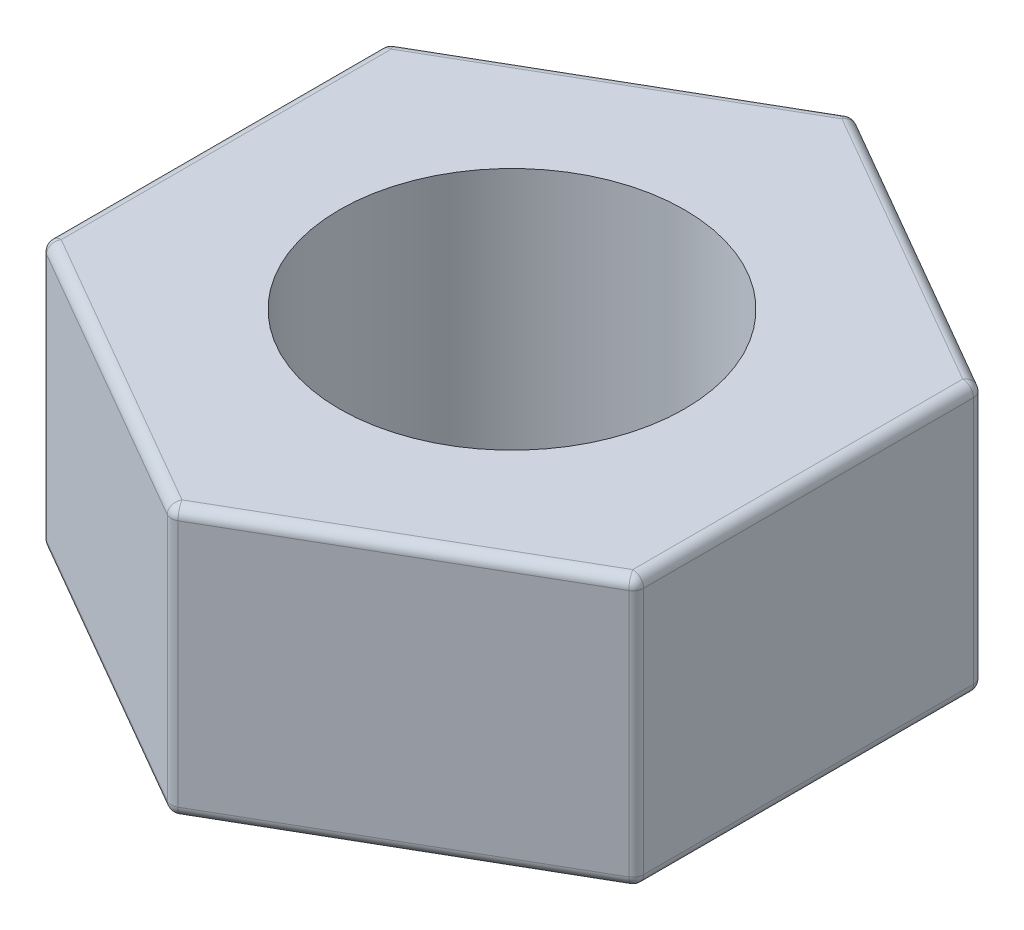
ISO-10303-21;
HEADER;
FILE_DESCRIPTION(('STEP AP214'),'2;1');
FILE_NAME('part.step','',(''),(''),'','','');
FILE_SCHEMA(('AUTOMOTIVE_DESIGN { 1 0 10303 214 1 1 1 1 }'));
ENDSEC;
DATA;
#1=APPLICATION_CONTEXT('core data for automotive mechanical design processes');
#2=APPLICATION_PROTOCOL_DEFINITION('international standard','automotive_design',2000,#1);
#3=PRODUCT_CONTEXT('',#1,'mechanical');
#4=PRODUCT('Part','Part','',(#3));
#5=PRODUCT_RELATED_PRODUCT_CATEGORY('part','',(#4));
#6=PRODUCT_DEFINITION_FORMATION('','',#4);
#7=PRODUCT_DEFINITION_CONTEXT('part definition',#1,'design');
#8=PRODUCT_DEFINITION('design','',#6,#7);
#9=PRODUCT_DEFINITION_SHAPE('','',#8);
#10=(LENGTH_UNIT() NAMED_UNIT(*) SI_UNIT(.MILLI.,.METRE.));
#11=(NAMED_UNIT(*) PLANE_ANGLE_UNIT() SI_UNIT($,.RADIAN.));
#12=(NAMED_UNIT(*) SI_UNIT($,.STERADIAN.) SOLID_ANGLE_UNIT());
#13=UNCERTAINTY_MEASURE_WITH_UNIT(LENGTH_MEASURE(1.E-05),#10,'distance_accuracy_value','');
#14=(GEOMETRIC_REPRESENTATION_CONTEXT(3) GLOBAL_UNCERTAINTY_ASSIGNED_CONTEXT((#13)) GLOBAL_UNIT_ASSIGNED_CONTEXT((#10,
#11,#12)) REPRESENTATION_CONTEXT('',''));
#15=CARTESIAN_POINT('',(0.,0.,0.));
#16=DIRECTION('',(0.,0.,1.));
#17=DIRECTION('',(1.,0.,0.));
#18=AXIS2_PLACEMENT_3D('',#15,#16,#17);
#19=CARTESIAN_POINT('',(0.,2.5,0.));
#20=DIRECTION('',(0.,1.,0.));
#21=DIRECTION('',(0.,0.,1.));
#22=AXIS2_PLACEMENT_3D('',#19,#20,#21);
#23=PLANE('',#22);
#24=DIRECTION('',(0.,0.,-1.));
#25=VECTOR('',#24,1.);
#26=CARTESIAN_POINT('',(2.64999999999998,2.5,-1.5877132402715));
#27=LINE('',#26,#25);
#28=CARTESIAN_POINT('',(2.65000000000002,2.5,1.52997821335248));
#29=VERTEX_POINT('',#28);
#30=CARTESIAN_POINT('',(2.64999999999998,2.5,-1.52997821335254));
#31=VERTEX_POINT('',#30);
#32=EDGE_CURVE('E167',#29,#31,#27,.T.);
#33=ORIENTED_EDGE('',*,*,#32,.T.);
#34=DIRECTION('',(-0.866025403784442,0.,-0.499999999999995));
#35=VECTOR('',#34,1.);
#36=CARTESIAN_POINT('',(-0.0499999999999995,2.5,-3.0888239401645));
#37=LINE('',#36,#35);
#38=CARTESIAN_POINT('',(0.,2.5,-3.05995642670502));
#39=VERTEX_POINT('',#38);
#40=EDGE_CURVE('E203',#31,#39,#37,.T.);
#41=ORIENTED_EDGE('',*,*,#40,.T.);
#42=DIRECTION('',(-0.866025403784438,0.,0.500000000000001));
#43=VECTOR('',#42,1.);
#44=CARTESIAN_POINT('',(-2.70000000000001,2.5,-1.50111069989302));
#45=LINE('',#44,#43);
#46=CARTESIAN_POINT('',(-2.65000000000001,2.5,-1.5299782133525));
#47=VERTEX_POINT('',#46);
#48=EDGE_CURVE('E201',#39,#47,#45,.T.);
#49=ORIENTED_EDGE('',*,*,#48,.T.);
#50=DIRECTION('',(0.,0.,1.));
#51=VECTOR('',#50,1.);
#52=CARTESIAN_POINT('',(-2.64999999999999,2.5,1.58771324027148));
#53=LINE('',#52,#51);
#54=CARTESIAN_POINT('',(-2.64999999999999,2.5,1.52997821335252));
#55=VERTEX_POINT('',#54);
#56=EDGE_CURVE('E163',#47,#55,#53,.T.);
#57=ORIENTED_EDGE('',*,*,#56,.T.);
#58=DIRECTION('',(0.866025403784442,0.,0.499999999999995));
#59=VECTOR('',#58,1.);
#60=CARTESIAN_POINT('',(0.050000000000022,2.5,3.0888239401645));
#61=LINE('',#60,#59);
#62=CARTESIAN_POINT('',(0.,2.5,3.05995642670502));
#63=VERTEX_POINT('',#62);
#64=EDGE_CURVE('E156',#55,#63,#61,.T.);
#65=ORIENTED_EDGE('',*,*,#64,.T.);
#66=DIRECTION('',(0.866025403784435,0.,-0.500000000000007));
#67=VECTOR('',#66,1.);
#68=CARTESIAN_POINT('',(2.70000000000002,2.5,1.501110699893));
#69=LINE('',#68,#67);
#70=EDGE_CURVE('E160',#63,#29,#69,.T.);
#71=ORIENTED_EDGE('',*,*,#70,.T.);
#72=EDGE_LOOP('',(#33,#41,#49,#57,#65,#71));
#73=FACE_BOUND('',#72,.T.);
#74=CARTESIAN_POINT('',(0.,2.5,0.));
#75=DIRECTION('',(0.,1.,0.));
#76=DIRECTION('',(0.,0.,1.));
#77=AXIS2_PLACEMENT_3D('',#74,#75,#76);
#78=CIRCLE('',#77,1.6);
#79=CARTESIAN_POINT('',(0.,2.5,1.6));
#80=VERTEX_POINT('',#79);
#81=EDGE_CURVE('E192',#80,#80,#78,.T.);
#82=ORIENTED_EDGE('',*,*,#81,.F.);
#83=EDGE_LOOP('',(#82));
#84=FACE_BOUND('',#83,.T.);
#85=ADVANCED_FACE('F33',(#73,#84),#23,.T.);
#86=CARTESIAN_POINT('',(0.,0.,0.));
#87=DIRECTION('',(0.,1.,0.));
#88=DIRECTION('',(0.,0.,1.));
#89=AXIS2_PLACEMENT_3D('',#86,#87,#88);
#90=PLANE('',#89);
#91=DIRECTION('',(-0.866025403784438,0.,0.500000000000001));
#92=VECTOR('',#91,1.);
#93=CARTESIAN_POINT('',(-1.325,0.,-2.29496732002876));
#94=LINE('',#93,#92);
#95=CARTESIAN_POINT('',(-2.65000000000001,0.,-1.5299782133525));
#96=VERTEX_POINT('',#95);
#97=CARTESIAN_POINT('',(0.,0.,-3.05995642670502));
#98=VERTEX_POINT('',#97);
#99=EDGE_CURVE('E223',#96,#98,#94,.F.);
#100=ORIENTED_EDGE('',*,*,#99,.T.);
#101=DIRECTION('',(-0.866025403784442,0.,-0.499999999999995));
#102=VECTOR('',#101,1.);
#103=CARTESIAN_POINT('',(1.32499999999999,0.,-2.29496732002878));
#104=LINE('',#103,#102);
#105=CARTESIAN_POINT('',(2.64999999999998,0.,-1.52997821335254));
#106=VERTEX_POINT('',#105);
#107=EDGE_CURVE('E225',#98,#106,#104,.F.);
#108=ORIENTED_EDGE('',*,*,#107,.T.);
#109=DIRECTION('',(0.,0.,-1.));
#110=VECTOR('',#109,1.);
#111=CARTESIAN_POINT('',(2.65,0.,0.));
#112=LINE('',#111,#110);
#113=CARTESIAN_POINT('',(2.65000000000002,0.,1.52997821335248));
#114=VERTEX_POINT('',#113);
#115=EDGE_CURVE('E217',#106,#114,#112,.F.);
#116=ORIENTED_EDGE('',*,*,#115,.T.);
#117=DIRECTION('',(0.866025403784435,0.,-0.500000000000007));
#118=VECTOR('',#117,1.);
#119=CARTESIAN_POINT('',(1.32500000000002,0.,2.29496732002875));
#120=LINE('',#119,#118);
#121=CARTESIAN_POINT('',(0.,0.,3.05995642670502));
#122=VERTEX_POINT('',#121);
#123=EDGE_CURVE('E215',#114,#122,#120,.F.);
#124=ORIENTED_EDGE('',*,*,#123,.T.);
#125=DIRECTION('',(0.866025403784442,0.,0.499999999999995));
#126=VECTOR('',#125,1.);
#127=CARTESIAN_POINT('',(-1.32499999999999,0.,2.29496732002877));
#128=LINE('',#127,#126);
#129=CARTESIAN_POINT('',(-2.64999999999999,0.,1.52997821335252));
#130=VERTEX_POINT('',#129);
#131=EDGE_CURVE('E219',#122,#130,#128,.F.);
#132=ORIENTED_EDGE('',*,*,#131,.T.);
#133=DIRECTION('',(0.,0.,1.));
#134=VECTOR('',#133,1.);
#135=CARTESIAN_POINT('',(-2.65,0.,0.));
#136=LINE('',#135,#134);
#137=EDGE_CURVE('E221',#130,#96,#136,.F.);
#138=ORIENTED_EDGE('',*,*,#137,.T.);
#139=EDGE_LOOP('',(#100,#108,#116,#124,#132,#138));
#140=FACE_BOUND('',#139,.T.);
#141=CARTESIAN_POINT('',(0.,0.,0.));
#142=DIRECTION('',(0.,1.,0.));
#143=DIRECTION('',(0.,0.,1.));
#144=AXIS2_PLACEMENT_3D('',#141,#142,#143);
#145=CIRCLE('',#144,1.6);
#146=CARTESIAN_POINT('',(0.,0.,1.6));
#147=VERTEX_POINT('',#146);
#148=EDGE_CURVE('E196',#147,#147,#145,.T.);
#149=ORIENTED_EDGE('',*,*,#148,.T.);
#150=EDGE_LOOP('',(#149));
#151=FACE_BOUND('',#150,.T.);
#152=ADVANCED_FACE('F362',(#140,#151),#90,.F.);
#153=CARTESIAN_POINT('',(2.74999999999998,2.5,-1.5877132402715));
#154=DIRECTION('',(-0.499999999999995,0.,0.866025403784442));
#155=DIRECTION('',(0.866025403784442,0.,0.499999999999995));
#156=AXIS2_PLACEMENT_3D('',#153,#154,#155);
#157=PLANE('',#156);
#158=DIRECTION('',(-0.866025403784442,0.,-0.499999999999995));
#159=VECTOR('',#158,1.);
#160=CARTESIAN_POINT('',(2.74999999999998,0.0999999999999998,-1.5877132402715));
#161=LINE('',#160,#159);
#162=CARTESIAN_POINT('',(2.69999999999998,0.0999999999999998,-1.61658075373098));
#163=VERTEX_POINT('',#162);
#164=CARTESIAN_POINT('',(0.0499999999999996,0.0999999999999998,-3.14655896708346));
#165=VERTEX_POINT('',#164);
#166=EDGE_CURVE('E208',#163,#165,#161,.T.);
#167=ORIENTED_EDGE('',*,*,#166,.T.);
#168=DIRECTION('',(0.,-1.,0.));
#169=VECTOR('',#168,1.);
#170=CARTESIAN_POINT('',(0.0499999999999997,2.5,-3.14655896708346));
#171=LINE('',#170,#169);
#172=CARTESIAN_POINT('',(0.0499999999999996,2.4,-3.14655896708346));
#173=VERTEX_POINT('',#172);
#174=EDGE_CURVE('E213',#165,#173,#171,.F.);
#175=ORIENTED_EDGE('',*,*,#174,.T.);
#176=DIRECTION('',(-0.866025403784442,0.,-0.499999999999995));
#177=VECTOR('',#176,1.);
#178=CARTESIAN_POINT('',(2.74999999999998,2.4,-1.5877132402715));
#179=LINE('',#178,#177);
#180=CARTESIAN_POINT('',(2.69999999999998,2.4,-1.61658075373098));
#181=VERTEX_POINT('',#180);
#182=EDGE_CURVE('E210',#173,#181,#179,.F.);
#183=ORIENTED_EDGE('',*,*,#182,.T.);
#184=DIRECTION('',(0.,-1.,0.));
#185=VECTOR('',#184,1.);
#186=CARTESIAN_POINT('',(2.69999999999998,2.5,-1.61658075373098));
#187=LINE('',#186,#185);
#188=EDGE_CURVE('E206',#181,#163,#187,.T.);
#189=ORIENTED_EDGE('',*,*,#188,.T.);
#190=EDGE_LOOP('',(#167,#175,#183,#189));
#191=FACE_BOUND('',#190,.T.);
#192=ADVANCED_FACE('F384',(#191),#157,.F.);
#193=CARTESIAN_POINT('',(0.,2.5,-3.17542648054294));
#194=DIRECTION('',(0.500000000000001,0.,0.866025403784438));
#195=DIRECTION('',(0.866025403784438,0.,-0.500000000000001));
#196=AXIS2_PLACEMENT_3D('',#193,#194,#195);
#197=PLANE('',#196);
#198=DIRECTION('',(-0.866025403784438,0.,0.500000000000001));
#199=VECTOR('',#198,1.);
#200=CARTESIAN_POINT('',(0.,2.4,-3.17542648054294));
#201=LINE('',#200,#199);
#202=CARTESIAN_POINT('',(-2.70000000000001,2.4,-1.61658075373095));
#203=VERTEX_POINT('',#202);
#204=CARTESIAN_POINT('',(-0.0499999999999998,2.4,-3.14655896708346));
#205=VERTEX_POINT('',#204);
#206=EDGE_CURVE('E232',#203,#205,#201,.F.);
#207=ORIENTED_EDGE('',*,*,#206,.T.);
#208=DIRECTION('',(0.,-1.,0.));
#209=VECTOR('',#208,1.);
#210=CARTESIAN_POINT('',(-0.0499999999999998,2.5,-3.14655896708346));
#211=LINE('',#210,#209);
#212=CARTESIAN_POINT('',(-0.0499999999999998,0.0999999999999998,-3.14655896708346));
#213=VERTEX_POINT('',#212);
#214=EDGE_CURVE('E234',#205,#213,#211,.T.);
#215=ORIENTED_EDGE('',*,*,#214,.T.);
#216=DIRECTION('',(-0.866025403784438,0.,0.500000000000001));
#217=VECTOR('',#216,1.);
#218=CARTESIAN_POINT('',(0.,0.0999999999999998,-3.17542648054294));
#219=LINE('',#218,#217);
#220=CARTESIAN_POINT('',(-2.70000000000001,0.0999999999999998,-1.61658075373095));
#221=VERTEX_POINT('',#220);
#222=EDGE_CURVE('E230',#213,#221,#219,.T.);
#223=ORIENTED_EDGE('',*,*,#222,.T.);
#224=DIRECTION('',(0.,-1.,0.));
#225=VECTOR('',#224,1.);
#226=CARTESIAN_POINT('',(-2.70000000000001,2.5,-1.61658075373095));
#227=LINE('',#226,#225);
#228=EDGE_CURVE('E228',#221,#203,#227,.F.);
#229=ORIENTED_EDGE('',*,*,#228,.T.);
#230=EDGE_LOOP('',(#207,#215,#223,#229));
#231=FACE_BOUND('',#230,.T.);
#232=ADVANCED_FACE('F397',(#231),#197,.F.);
#233=CARTESIAN_POINT('',(-2.75,2.5,-1.58771324027147));
#234=DIRECTION('',(1.,0.,0.));
#235=DIRECTION('',(0.,0.,-1.));
#236=AXIS2_PLACEMENT_3D('',#233,#234,#235);
#237=PLANE('',#236);
#238=DIRECTION('',(0.,0.,1.));
#239=VECTOR('',#238,1.);
#240=CARTESIAN_POINT('',(-2.75,2.4,-1.58771324027147));
#241=LINE('',#240,#239);
#242=CARTESIAN_POINT('',(-2.74999999999999,2.4,1.52997821335252));
#243=VERTEX_POINT('',#242);
#244=CARTESIAN_POINT('',(-2.75,2.4,-1.5299782133525));
#245=VERTEX_POINT('',#244);
#246=EDGE_CURVE('E241',#243,#245,#241,.F.);
#247=ORIENTED_EDGE('',*,*,#246,.T.);
#248=DIRECTION('',(0.,-1.,0.));
#249=VECTOR('',#248,1.);
#250=CARTESIAN_POINT('',(-2.75,2.5,-1.5299782133525));
#251=LINE('',#250,#249);
#252=CARTESIAN_POINT('',(-2.75,0.0999999999999998,-1.5299782133525));
#253=VERTEX_POINT('',#252);
#254=EDGE_CURVE('E243',#245,#253,#251,.T.);
#255=ORIENTED_EDGE('',*,*,#254,.T.);
#256=DIRECTION('',(0.,0.,1.));
#257=VECTOR('',#256,1.);
#258=CARTESIAN_POINT('',(-2.75,0.0999999999999998,-1.58771324027147));
#259=LINE('',#258,#257);
#260=CARTESIAN_POINT('',(-2.74999999999999,0.0999999999999998,1.52997821335252));
#261=VERTEX_POINT('',#260);
#262=EDGE_CURVE('E239',#253,#261,#259,.T.);
#263=ORIENTED_EDGE('',*,*,#262,.T.);
#264=DIRECTION('',(0.,-1.,0.));
#265=VECTOR('',#264,1.);
#266=CARTESIAN_POINT('',(-2.74999999999999,2.5,1.52997821335252));
#267=LINE('',#266,#265);
#268=EDGE_CURVE('E237',#261,#243,#267,.F.);
#269=ORIENTED_EDGE('',*,*,#268,.T.);
#270=EDGE_LOOP('',(#247,#255,#263,#269));
#271=FACE_BOUND('',#270,.T.);
#272=ADVANCED_FACE('F393',(#271),#237,.F.);
#273=CARTESIAN_POINT('',(-2.74999999999999,2.5,1.58771324027148));
#274=DIRECTION('',(0.499999999999995,0.,-0.866025403784442));
#275=DIRECTION('',(-0.866025403784442,0.,-0.499999999999995));
#276=AXIS2_PLACEMENT_3D('',#273,#274,#275);
#277=PLANE('',#276);
#278=DIRECTION('',(0.866025403784442,0.,0.499999999999995));
#279=VECTOR('',#278,1.);
#280=CARTESIAN_POINT('',(-2.74999999999999,2.4,1.58771324027148));
#281=LINE('',#280,#279);
#282=CARTESIAN_POINT('',(-0.0499999999999781,2.4,3.14655896708346));
#283=VERTEX_POINT('',#282);
#284=CARTESIAN_POINT('',(-2.69999999999999,2.4,1.61658075373097));
#285=VERTEX_POINT('',#284);
#286=EDGE_CURVE('E174',#283,#285,#281,.F.);
#287=ORIENTED_EDGE('',*,*,#286,.T.);
#288=DIRECTION('',(0.,-1.,0.));
#289=VECTOR('',#288,1.);
#290=CARTESIAN_POINT('',(-2.69999999999999,2.5,1.61658075373097));
#291=LINE('',#290,#289);
#292=CARTESIAN_POINT('',(-2.69999999999999,0.0999999999999998,1.61658075373097));
#293=VERTEX_POINT('',#292);
#294=EDGE_CURVE('E251',#285,#293,#291,.T.);
#295=ORIENTED_EDGE('',*,*,#294,.T.);
#296=DIRECTION('',(0.866025403784442,0.,0.499999999999995));
#297=VECTOR('',#296,1.);
#298=CARTESIAN_POINT('',(-2.74999999999999,0.0999999999999998,1.58771324027148));
#299=LINE('',#298,#297);
#300=CARTESIAN_POINT('',(-0.0499999999999781,0.0999999999999998,3.14655896708346));
#301=VERTEX_POINT('',#300);
#302=EDGE_CURVE('E248',#293,#301,#299,.T.);
#303=ORIENTED_EDGE('',*,*,#302,.T.);
#304=DIRECTION('',(0.,-1.,0.));
#305=VECTOR('',#304,1.);
#306=CARTESIAN_POINT('',(-0.049999999999978,2.5,3.14655896708346));
#307=LINE('',#306,#305);
#308=EDGE_CURVE('E246',#301,#283,#307,.F.);
#309=ORIENTED_EDGE('',*,*,#308,.T.);
#310=EDGE_LOOP('',(#287,#295,#303,#309));
#311=FACE_BOUND('',#310,.T.);
#312=ADVANCED_FACE('F390',(#311),#277,.F.);
#313=CARTESIAN_POINT('',(0.,2.5,3.17542648054294));
#314=DIRECTION('',(-0.500000000000007,0.,-0.866025403784435));
#315=DIRECTION('',(-0.866025403784435,0.,0.500000000000007));
#316=AXIS2_PLACEMENT_3D('',#313,#314,#315);
#317=PLANE('',#316);
#318=DIRECTION('',(0.866025403784435,0.,-0.500000000000007));
#319=VECTOR('',#318,1.);
#320=CARTESIAN_POINT('',(0.,2.4,3.17542648054294));
#321=LINE('',#320,#319);
#322=CARTESIAN_POINT('',(2.70000000000002,2.4,1.61658075373093));
#323=VERTEX_POINT('',#322);
#324=CARTESIAN_POINT('',(0.050000000000022,2.4,3.14655896708346));
#325=VERTEX_POINT('',#324);
#326=EDGE_CURVE('E42',#323,#325,#321,.F.);
#327=ORIENTED_EDGE('',*,*,#326,.T.);
#328=DIRECTION('',(0.,-1.,0.));
#329=VECTOR('',#328,1.);
#330=CARTESIAN_POINT('',(0.050000000000022,2.5,3.14655896708346));
#331=LINE('',#330,#329);
#332=CARTESIAN_POINT('',(0.050000000000022,0.0999999999999998,3.14655896708346));
#333=VERTEX_POINT('',#332);
#334=EDGE_CURVE('E11',#325,#333,#331,.T.);
#335=ORIENTED_EDGE('',*,*,#334,.T.);
#336=DIRECTION('',(0.866025403784435,0.,-0.500000000000007));
#337=VECTOR('',#336,1.);
#338=CARTESIAN_POINT('',(0.,0.0999999999999998,3.17542648054294));
#339=LINE('',#338,#337);
#340=CARTESIAN_POINT('',(2.70000000000002,0.0999999999999998,1.61658075373093));
#341=VERTEX_POINT('',#340);
#342=EDGE_CURVE('E263',#333,#341,#339,.T.);
#343=ORIENTED_EDGE('',*,*,#342,.T.);
#344=DIRECTION('',(0.,-1.,0.));
#345=VECTOR('',#344,1.);
#346=CARTESIAN_POINT('',(2.70000000000002,2.5,1.61658075373093));
#347=LINE('',#346,#345);
#348=EDGE_CURVE('E53',#341,#323,#347,.F.);
#349=ORIENTED_EDGE('',*,*,#348,.T.);
#350=EDGE_LOOP('',(#327,#335,#343,#349));
#351=FACE_BOUND('',#350,.T.);
#352=ADVANCED_FACE('F376',(#351),#317,.F.);
#353=CARTESIAN_POINT('',(2.75000000000002,2.5,1.58771324027145));
#354=DIRECTION('',(-1.,0.,0.));
#355=DIRECTION('',(0.,0.,1.));
#356=AXIS2_PLACEMENT_3D('',#353,#354,#355);
#357=PLANE('',#356);
#358=DIRECTION('',(0.,-1.,0.));
#359=VECTOR('',#358,1.);
#360=CARTESIAN_POINT('',(2.74999999999998,2.5,-1.52997821335254));
#361=LINE('',#360,#359);
#362=CARTESIAN_POINT('',(2.74999999999998,0.0999999999999998,-1.52997821335254));
#363=VERTEX_POINT('',#362);
#364=CARTESIAN_POINT('',(2.74999999999998,2.4,-1.52997821335254));
#365=VERTEX_POINT('',#364);
#366=EDGE_CURVE('E258',#363,#365,#361,.F.);
#367=ORIENTED_EDGE('',*,*,#366,.T.);
#368=DIRECTION('',(0.,0.,-1.));
#369=VECTOR('',#368,1.);
#370=CARTESIAN_POINT('',(2.75000000000002,2.4,1.58771324027145));
#371=LINE('',#370,#369);
#372=CARTESIAN_POINT('',(2.75000000000002,2.4,1.52997821335248));
#373=VERTEX_POINT('',#372);
#374=EDGE_CURVE('E260',#365,#373,#371,.F.);
#375=ORIENTED_EDGE('',*,*,#374,.T.);
#376=DIRECTION('',(0.,-1.,0.));
#377=VECTOR('',#376,1.);
#378=CARTESIAN_POINT('',(2.75000000000002,2.5,1.52997821335248));
#379=LINE('',#378,#377);
#380=CARTESIAN_POINT('',(2.75000000000002,0.0999999999999998,1.52997821335248));
#381=VERTEX_POINT('',#380);
#382=EDGE_CURVE('E254',#373,#381,#379,.T.);
#383=ORIENTED_EDGE('',*,*,#382,.T.);
#384=DIRECTION('',(0.,0.,-1.));
#385=VECTOR('',#384,1.);
#386=CARTESIAN_POINT('',(2.75000000000002,0.0999999999999998,1.58771324027145));
#387=LINE('',#386,#385);
#388=EDGE_CURVE('E256',#381,#363,#387,.T.);
#389=ORIENTED_EDGE('',*,*,#388,.T.);
#390=EDGE_LOOP('',(#367,#375,#383,#389));
#391=FACE_BOUND('',#390,.T.);
#392=ADVANCED_FACE('F366',(#391),#357,.F.);
#393=CARTESIAN_POINT('',(0.,2.5,0.));
#394=DIRECTION('',(0.,-1.,0.));
#395=DIRECTION('',(0.,0.,-1.));
#396=AXIS2_PLACEMENT_3D('',#393,#394,#395);
#397=CYLINDRICAL_SURFACE('',#396,1.6);
#398=ORIENTED_EDGE('',*,*,#81,.T.);
#399=EDGE_LOOP('',(#398));
#400=FACE_BOUND('',#399,.T.);
#401=ORIENTED_EDGE('',*,*,#148,.F.);
#402=EDGE_LOOP('',(#401));
#403=FACE_BOUND('',#402,.T.);
#404=ADVANCED_FACE('F364',(#400,#403),#397,.F.);
#405=CARTESIAN_POINT('',(-2.69999999999999,0.0999999999999998,1.50111069989304));
#406=DIRECTION('',(0.866025403784442,0.,0.499999999999995));
#407=DIRECTION('',(0.499999999999995,0.,-0.866025403784442));
#408=AXIS2_PLACEMENT_3D('',#405,#406,#407);
#409=CYLINDRICAL_SURFACE('',#408,0.1);
#410=CARTESIAN_POINT('',(0.,0.0999999999999998,3.05995642670502));
#411=DIRECTION('',(0.866025403784441,0.,0.499999999999995));
#412=DIRECTION('',(0.499999999999995,0.,-0.866025403784441));
#413=AXIS2_PLACEMENT_3D('',#410,#411,#412);
#414=CIRCLE('',#413,0.1);
#415=EDGE_CURVE('E37',#301,#122,#414,.T.);
#416=ORIENTED_EDGE('',*,*,#415,.F.);
#417=ORIENTED_EDGE('',*,*,#302,.F.);
#418=CARTESIAN_POINT('',(-2.64999999999999,0.1,1.52997821335252));
#419=DIRECTION('',(-0.86602540378444,0.,-0.499999999999998));
#420=DIRECTION('',(-0.499999999999998,0.,0.86602540378444));
#421=AXIS2_PLACEMENT_3D('',#418,#419,#420);
#422=CIRCLE('',#421,0.1);
#423=EDGE_CURVE('E347',#130,#293,#422,.T.);
#424=ORIENTED_EDGE('',*,*,#423,.F.);
#425=ORIENTED_EDGE('',*,*,#131,.F.);
#426=EDGE_LOOP('',(#416,#417,#424,#425));
#427=FACE_BOUND('',#426,.T.);
#428=ADVANCED_FACE('F35',(#427),#409,.T.);
#429=CARTESIAN_POINT('',(0.,0.1,3.05995642670502));
#430=DIRECTION('',(0.,-1.,0.));
#431=DIRECTION('',(1.,0.,0.));
#432=AXIS2_PLACEMENT_3D('',#429,#430,#431);
#433=SPHERICAL_SURFACE('',#432,0.1);
#434=CARTESIAN_POINT('',(0.,0.0999999999999998,3.05995642670502));
#435=DIRECTION('',(0.,-1.,0.));
#436=DIRECTION('',(0.,0.,-1.));
#437=AXIS2_PLACEMENT_3D('',#434,#435,#436);
#438=CIRCLE('',#437,0.1);
#439=EDGE_CURVE('E342',#301,#333,#438,.F.);
#440=ORIENTED_EDGE('',*,*,#439,.F.);
#441=ORIENTED_EDGE('',*,*,#415,.T.);
#442=CARTESIAN_POINT('',(0.,0.1,3.05995642670502));
#443=DIRECTION('',(-0.866025403784435,0.,0.500000000000007));
#444=DIRECTION('',(0.500000000000007,0.,0.866025403784435));
#445=AXIS2_PLACEMENT_3D('',#442,#443,#444);
#446=CIRCLE('',#445,0.1);
#447=EDGE_CURVE('E345',#333,#122,#446,.F.);
#448=ORIENTED_EDGE('',*,*,#447,.F.);
#449=EDGE_LOOP('',(#440,#441,#448));
#450=FACE_BOUND('',#449,.T.);
#451=ADVANCED_FACE('F373',(#450),#433,.T.);
#452=CARTESIAN_POINT('',(-2.64999999999999,0.1,1.52997821335252));
#453=DIRECTION('',(0.,-1.,0.));
#454=DIRECTION('',(0.,0.,-1.));
#455=AXIS2_PLACEMENT_3D('',#452,#453,#454);
#456=SPHERICAL_SURFACE('',#455,0.1);
#457=CARTESIAN_POINT('',(-2.64999999999999,0.0999999999999998,1.52997821335252));
#458=DIRECTION('',(0.,0.,1.));
#459=DIRECTION('',(1.,0.,0.));
#460=AXIS2_PLACEMENT_3D('',#457,#458,#459);
#461=CIRCLE('',#460,0.1);
#462=EDGE_CURVE('E337',#130,#261,#461,.F.);
#463=ORIENTED_EDGE('',*,*,#462,.F.);
#464=ORIENTED_EDGE('',*,*,#423,.T.);
#465=CARTESIAN_POINT('',(-2.64999999999999,0.0999999999999998,1.52997821335252));
#466=DIRECTION('',(0.,-1.,0.));
#467=DIRECTION('',(0.,0.,-1.));
#468=AXIS2_PLACEMENT_3D('',#465,#466,#467);
#469=CIRCLE('',#468,0.1);
#470=EDGE_CURVE('E340',#261,#293,#469,.F.);
#471=ORIENTED_EDGE('',*,*,#470,.F.);
#472=EDGE_LOOP('',(#463,#464,#471));
#473=FACE_BOUND('',#472,.T.);
#474=ADVANCED_FACE('F506',(#473),#456,.T.);
#475=CARTESIAN_POINT('',(-0.0499999999999785,0.0999999999999998,3.0888239401645));
#476=DIRECTION('',(0.866025403784435,0.,-0.500000000000007));
#477=DIRECTION('',(-0.500000000000007,0.,-0.866025403784435));
#478=AXIS2_PLACEMENT_3D('',#475,#476,#477);
#479=CYLINDRICAL_SURFACE('',#478,0.1);
#480=ORIENTED_EDGE('',*,*,#447,.T.);
#481=ORIENTED_EDGE('',*,*,#123,.F.);
#482=CARTESIAN_POINT('',(2.65000000000002,0.0999999999999998,1.52997821335248));
#483=DIRECTION('',(0.866025403784435,0.,-0.500000000000006));
#484=DIRECTION('',(-0.500000000000006,0.,-0.866025403784435));
#485=AXIS2_PLACEMENT_3D('',#482,#483,#484);
#486=CIRCLE('',#485,0.1);
#487=EDGE_CURVE('E334',#341,#114,#486,.T.);
#488=ORIENTED_EDGE('',*,*,#487,.F.);
#489=ORIENTED_EDGE('',*,*,#342,.F.);
#490=EDGE_LOOP('',(#480,#481,#488,#489));
#491=FACE_BOUND('',#490,.T.);
#492=ADVANCED_FACE('F502',(#491),#479,.T.);
#493=CARTESIAN_POINT('',(0.,2.5,3.05995642670502));
#494=DIRECTION('',(0.,-1.,0.));
#495=DIRECTION('',(0.,0.,-1.));
#496=AXIS2_PLACEMENT_3D('',#493,#494,#495);
#497=CYLINDRICAL_SURFACE('',#496,0.1);
#498=ORIENTED_EDGE('',*,*,#439,.T.);
#499=ORIENTED_EDGE('',*,*,#334,.F.);
#500=CARTESIAN_POINT('',(0.,2.4,3.05995642670502));
#501=DIRECTION('',(0.,1.,0.));
#502=DIRECTION('',(0.,0.,1.));
#503=AXIS2_PLACEMENT_3D('',#500,#501,#502);
#504=CIRCLE('',#503,0.1);
#505=EDGE_CURVE('E178',#283,#325,#504,.T.);
#506=ORIENTED_EDGE('',*,*,#505,.F.);
#507=ORIENTED_EDGE('',*,*,#308,.F.);
#508=EDGE_LOOP('',(#498,#499,#506,#507));
#509=FACE_BOUND('',#508,.T.);
#510=ADVANCED_FACE('F499',(#509),#497,.T.);
#511=CARTESIAN_POINT('',(-1.32499999999999,2.4,2.29496732002877));
#512=DIRECTION('',(-0.866025403784442,0.,-0.499999999999995));
#513=DIRECTION('',(-0.499999999999995,0.,0.866025403784442));
#514=AXIS2_PLACEMENT_3D('',#511,#512,#513);
#515=CYLINDRICAL_SURFACE('',#514,0.1);
#516=CARTESIAN_POINT('',(-2.64999999999999,2.4,1.52997821335252));
#517=DIRECTION('',(-0.866025403784441,0.,-0.499999999999997));
#518=DIRECTION('',(-0.499999999999997,0.,0.866025403784441));
#519=AXIS2_PLACEMENT_3D('',#516,#517,#518);
#520=CIRCLE('',#519,0.1);
#521=EDGE_CURVE('E179',#285,#55,#520,.T.);
#522=ORIENTED_EDGE('',*,*,#521,.F.);
#523=ORIENTED_EDGE('',*,*,#286,.F.);
#524=CARTESIAN_POINT('',(0.,2.4,3.05995642670502));
#525=DIRECTION('',(0.866025403784444,0.,0.499999999999992));
#526=DIRECTION('',(0.499999999999992,0.,-0.866025403784444));
#527=AXIS2_PLACEMENT_3D('',#524,#525,#526);
#528=CIRCLE('',#527,0.1);
#529=EDGE_CURVE('E171',#63,#283,#528,.T.);
#530=ORIENTED_EDGE('',*,*,#529,.F.);
#531=ORIENTED_EDGE('',*,*,#64,.F.);
#532=EDGE_LOOP('',(#522,#523,#530,#531));
#533=FACE_BOUND('',#532,.T.);
#534=ADVANCED_FACE('F173',(#533),#515,.T.);
#535=CARTESIAN_POINT('',(-2.64999999999999,2.5,1.52997821335252));
#536=DIRECTION('',(0.,-1.,0.));
#537=DIRECTION('',(0.,0.,-1.));
#538=AXIS2_PLACEMENT_3D('',#535,#536,#537);
#539=CYLINDRICAL_SURFACE('',#538,0.1);
#540=ORIENTED_EDGE('',*,*,#470,.T.);
#541=ORIENTED_EDGE('',*,*,#294,.F.);
#542=CARTESIAN_POINT('',(-2.64999999999999,2.4,1.52997821335252));
#543=DIRECTION('',(0.,1.,0.));
#544=DIRECTION('',(0.,0.,1.));
#545=AXIS2_PLACEMENT_3D('',#542,#543,#544);
#546=CIRCLE('',#545,0.1);
#547=EDGE_CURVE('E329',#243,#285,#546,.T.);
#548=ORIENTED_EDGE('',*,*,#547,.F.);
#549=ORIENTED_EDGE('',*,*,#268,.F.);
#550=EDGE_LOOP('',(#540,#541,#548,#549));
#551=FACE_BOUND('',#550,.T.);
#552=ADVANCED_FACE('F492',(#551),#539,.T.);
#553=CARTESIAN_POINT('',(-2.65000000000001,0.0999999999999998,-1.58771324027147));
#554=DIRECTION('',(0.,0.,1.));
#555=DIRECTION('',(1.,0.,0.));
#556=AXIS2_PLACEMENT_3D('',#553,#554,#555);
#557=CYLINDRICAL_SURFACE('',#556,0.1);
#558=ORIENTED_EDGE('',*,*,#462,.T.);
#559=ORIENTED_EDGE('',*,*,#262,.F.);
#560=CARTESIAN_POINT('',(-2.65000000000001,0.1,-1.5299782133525));
#561=DIRECTION('',(0.,0.,-1.));
#562=DIRECTION('',(-1.,0.,0.));
#563=AXIS2_PLACEMENT_3D('',#560,#561,#562);
#564=CIRCLE('',#563,0.1);
#565=EDGE_CURVE('E326',#96,#253,#564,.T.);
#566=ORIENTED_EDGE('',*,*,#565,.F.);
#567=ORIENTED_EDGE('',*,*,#137,.F.);
#568=EDGE_LOOP('',(#558,#559,#566,#567));
#569=FACE_BOUND('',#568,.T.);
#570=ADVANCED_FACE('F488',(#569),#557,.T.);
#571=CARTESIAN_POINT('',(2.65000000000002,0.1,1.52997821335248));
#572=DIRECTION('',(0.,-1.,0.));
#573=DIRECTION('',(0.,0.,-1.));
#574=AXIS2_PLACEMENT_3D('',#571,#572,#573);
#575=SPHERICAL_SURFACE('',#574,0.1);
#576=CARTESIAN_POINT('',(2.65000000000002,0.0999999999999998,1.52997821335248));
#577=DIRECTION('',(0.,-1.,0.));
#578=DIRECTION('',(0.,0.,-1.));
#579=AXIS2_PLACEMENT_3D('',#576,#577,#578);
#580=CIRCLE('',#579,0.1);
#581=EDGE_CURVE('E185',#341,#381,#580,.F.);
#582=ORIENTED_EDGE('',*,*,#581,.F.);
#583=ORIENTED_EDGE('',*,*,#487,.T.);
#584=CARTESIAN_POINT('',(2.65000000000002,0.1,1.52997821335248));
#585=DIRECTION('',(0.,0.,1.));
#586=DIRECTION('',(1.,0.,0.));
#587=AXIS2_PLACEMENT_3D('',#584,#585,#586);
#588=CIRCLE('',#587,0.1);
#589=EDGE_CURVE('E323',#381,#114,#588,.F.);
#590=ORIENTED_EDGE('',*,*,#589,.F.);
#591=EDGE_LOOP('',(#582,#583,#590));
#592=FACE_BOUND('',#591,.T.);
#593=ADVANCED_FACE('F485',(#592),#575,.T.);
#594=CARTESIAN_POINT('',(0.,2.4,3.05995642670502));
#595=DIRECTION('',(0.,1.,0.));
#596=DIRECTION('',(-1.,0.,0.));
#597=AXIS2_PLACEMENT_3D('',#594,#595,#596);
#598=SPHERICAL_SURFACE('',#597,0.1);
#599=ORIENTED_EDGE('',*,*,#529,.T.);
#600=ORIENTED_EDGE('',*,*,#505,.T.);
#601=CARTESIAN_POINT('',(0.,2.4,3.05995642670502));
#602=DIRECTION('',(-0.866025403784435,0.,0.500000000000006));
#603=DIRECTION('',(0.500000000000006,0.,0.866025403784435));
#604=AXIS2_PLACEMENT_3D('',#601,#602,#603);
#605=CIRCLE('',#604,0.1);
#606=EDGE_CURVE('E182',#63,#325,#605,.F.);
#607=ORIENTED_EDGE('',*,*,#606,.F.);
#608=EDGE_LOOP('',(#599,#600,#607));
#609=FACE_BOUND('',#608,.T.);
#610=ADVANCED_FACE('F183',(#609),#598,.T.);
#611=CARTESIAN_POINT('',(-2.64999999999999,2.4,1.52997821335252));
#612=DIRECTION('',(0.,1.,0.));
#613=DIRECTION('',(0.,0.,1.));
#614=AXIS2_PLACEMENT_3D('',#611,#612,#613);
#615=SPHERICAL_SURFACE('',#614,0.1);
#616=ORIENTED_EDGE('',*,*,#547,.T.);
#617=ORIENTED_EDGE('',*,*,#521,.T.);
#618=CARTESIAN_POINT('',(-2.64999999999999,2.4,1.52997821335252));
#619=DIRECTION('',(0.,0.,1.));
#620=DIRECTION('',(1.,0.,0.));
#621=AXIS2_PLACEMENT_3D('',#618,#619,#620);
#622=CIRCLE('',#621,0.1);
#623=EDGE_CURVE('E186',#243,#55,#622,.F.);
#624=ORIENTED_EDGE('',*,*,#623,.F.);
#625=EDGE_LOOP('',(#616,#617,#624));
#626=FACE_BOUND('',#625,.T.);
#627=ADVANCED_FACE('F478',(#626),#615,.T.);
#628=CARTESIAN_POINT('',(-2.65000000000001,0.1,-1.5299782133525));
#629=DIRECTION('',(0.,-1.,0.));
#630=DIRECTION('',(0.,0.,-1.));
#631=AXIS2_PLACEMENT_3D('',#628,#629,#630);
#632=SPHERICAL_SURFACE('',#631,0.1);
#633=CARTESIAN_POINT('',(-2.65,0.0999999999999998,-1.5299782133525));
#634=DIRECTION('',(-0.866025403784438,0.,0.500000000000001));
#635=DIRECTION('',(0.500000000000001,0.,0.866025403784438));
#636=AXIS2_PLACEMENT_3D('',#633,#634,#635);
#637=CIRCLE('',#636,0.1);
#638=EDGE_CURVE('E314',#96,#221,#637,.F.);
#639=ORIENTED_EDGE('',*,*,#638,.F.);
#640=ORIENTED_EDGE('',*,*,#565,.T.);
#641=CARTESIAN_POINT('',(-2.65000000000001,0.0999999999999998,-1.5299782133525));
#642=DIRECTION('',(0.,-1.,0.));
#643=DIRECTION('',(0.,0.,-1.));
#644=AXIS2_PLACEMENT_3D('',#641,#642,#643);
#645=CIRCLE('',#644,0.1);
#646=EDGE_CURVE('E317',#221,#253,#645,.F.);
#647=ORIENTED_EDGE('',*,*,#646,.F.);
#648=EDGE_LOOP('',(#639,#640,#647));
#649=FACE_BOUND('',#648,.T.);
#650=ADVANCED_FACE('F474',(#649),#632,.T.);
#651=CARTESIAN_POINT('',(2.65000000000002,0.0999999999999998,1.58771324027145));
#652=DIRECTION('',(0.,0.,-1.));
#653=DIRECTION('',(-1.,0.,0.));
#654=AXIS2_PLACEMENT_3D('',#651,#652,#653);
#655=CYLINDRICAL_SURFACE('',#654,0.1);
#656=ORIENTED_EDGE('',*,*,#589,.T.);
#657=ORIENTED_EDGE('',*,*,#115,.F.);
#658=CARTESIAN_POINT('',(2.64999999999998,0.0999999999999998,-1.52997821335254));
#659=DIRECTION('',(0.,0.,-1.));
#660=DIRECTION('',(-1.,0.,0.));
#661=AXIS2_PLACEMENT_3D('',#658,#659,#660);
#662=CIRCLE('',#661,0.1);
#663=EDGE_CURVE('E309',#363,#106,#662,.T.);
#664=ORIENTED_EDGE('',*,*,#663,.F.);
#665=ORIENTED_EDGE('',*,*,#388,.F.);
#666=EDGE_LOOP('',(#656,#657,#664,#665));
#667=FACE_BOUND('',#666,.T.);
#668=ADVANCED_FACE('F470',(#667),#655,.T.);
#669=CARTESIAN_POINT('',(2.65000000000002,2.5,1.52997821335248));
#670=DIRECTION('',(0.,-1.,0.));
#671=DIRECTION('',(0.,0.,-1.));
#672=AXIS2_PLACEMENT_3D('',#669,#670,#671);
#673=CYLINDRICAL_SURFACE('',#672,0.1);
#674=ORIENTED_EDGE('',*,*,#581,.T.);
#675=ORIENTED_EDGE('',*,*,#382,.F.);
#676=CARTESIAN_POINT('',(2.65000000000002,2.4,1.52997821335248));
#677=DIRECTION('',(0.,1.,0.));
#678=DIRECTION('',(0.,0.,1.));
#679=AXIS2_PLACEMENT_3D('',#676,#677,#678);
#680=CIRCLE('',#679,0.1);
#681=EDGE_CURVE('E306',#323,#373,#680,.T.);
#682=ORIENTED_EDGE('',*,*,#681,.F.);
#683=ORIENTED_EDGE('',*,*,#348,.F.);
#684=EDGE_LOOP('',(#674,#675,#682,#683));
#685=FACE_BOUND('',#684,.T.);
#686=ADVANCED_FACE('F467',(#685),#673,.T.);
#687=CARTESIAN_POINT('',(1.32500000000002,2.4,2.29496732002875));
#688=DIRECTION('',(-0.866025403784435,0.,0.500000000000007));
#689=DIRECTION('',(0.500000000000007,0.,0.866025403784435));
#690=AXIS2_PLACEMENT_3D('',#687,#688,#689);
#691=CYLINDRICAL_SURFACE('',#690,0.1);
#692=ORIENTED_EDGE('',*,*,#606,.T.);
#693=ORIENTED_EDGE('',*,*,#326,.F.);
#694=CARTESIAN_POINT('',(2.65000000000002,2.4,1.52997821335248));
#695=DIRECTION('',(0.866025403784436,0.,-0.500000000000005));
#696=DIRECTION('',(-0.500000000000005,0.,-0.866025403784436));
#697=AXIS2_PLACEMENT_3D('',#694,#695,#696);
#698=CIRCLE('',#697,0.1);
#699=EDGE_CURVE('E190',#29,#323,#698,.T.);
#700=ORIENTED_EDGE('',*,*,#699,.F.);
#701=ORIENTED_EDGE('',*,*,#70,.F.);
#702=EDGE_LOOP('',(#692,#693,#700,#701));
#703=FACE_BOUND('',#702,.T.);
#704=ADVANCED_FACE('F188',(#703),#691,.T.);
#705=CARTESIAN_POINT('',(-2.65,2.4,0.));
#706=DIRECTION('',(0.,0.,-1.));
#707=DIRECTION('',(-1.,0.,0.));
#708=AXIS2_PLACEMENT_3D('',#705,#706,#707);
#709=CYLINDRICAL_SURFACE('',#708,0.1);
#710=ORIENTED_EDGE('',*,*,#623,.T.);
#711=ORIENTED_EDGE('',*,*,#56,.F.);
#712=CARTESIAN_POINT('',(-2.65000000000001,2.4,-1.5299782133525));
#713=DIRECTION('',(0.,0.,-1.));
#714=DIRECTION('',(-1.,0.,0.));
#715=AXIS2_PLACEMENT_3D('',#712,#713,#714);
#716=CIRCLE('',#715,0.1);
#717=EDGE_CURVE('E302',#245,#47,#716,.T.);
#718=ORIENTED_EDGE('',*,*,#717,.F.);
#719=ORIENTED_EDGE('',*,*,#246,.F.);
#720=EDGE_LOOP('',(#710,#711,#718,#719));
#721=FACE_BOUND('',#720,.T.);
#722=ADVANCED_FACE('F460',(#721),#709,.T.);
#723=CARTESIAN_POINT('',(-2.65000000000001,2.5,-1.5299782133525));
#724=DIRECTION('',(0.,-1.,0.));
#725=DIRECTION('',(0.,0.,-1.));
#726=AXIS2_PLACEMENT_3D('',#723,#724,#725);
#727=CYLINDRICAL_SURFACE('',#726,0.1);
#728=ORIENTED_EDGE('',*,*,#646,.T.);
#729=ORIENTED_EDGE('',*,*,#254,.F.);
#730=CARTESIAN_POINT('',(-2.65,2.4,-1.5299782133525));
#731=DIRECTION('',(0.,1.,0.));
#732=DIRECTION('',(0.,0.,1.));
#733=AXIS2_PLACEMENT_3D('',#730,#731,#732);
#734=CIRCLE('',#733,0.1);
#735=EDGE_CURVE('E299',#203,#245,#734,.T.);
#736=ORIENTED_EDGE('',*,*,#735,.F.);
#737=ORIENTED_EDGE('',*,*,#228,.F.);
#738=EDGE_LOOP('',(#728,#729,#736,#737));
#739=FACE_BOUND('',#738,.T.);
#740=ADVANCED_FACE('F456',(#739),#727,.T.);
#741=CARTESIAN_POINT('',(0.0500000000000001,0.0999999999999998,-3.0888239401645));
#742=DIRECTION('',(-0.866025403784438,0.,0.500000000000001));
#743=DIRECTION('',(0.500000000000001,0.,0.866025403784438));
#744=AXIS2_PLACEMENT_3D('',#741,#742,#743);
#745=CYLINDRICAL_SURFACE('',#744,0.1);
#746=ORIENTED_EDGE('',*,*,#638,.T.);
#747=ORIENTED_EDGE('',*,*,#222,.F.);
#748=CARTESIAN_POINT('',(0.,0.1,-3.05995642670502));
#749=DIRECTION('',(0.866025403784438,0.,-0.500000000000001));
#750=DIRECTION('',(-0.500000000000001,0.,-0.866025403784438));
#751=AXIS2_PLACEMENT_3D('',#748,#749,#750);
#752=CIRCLE('',#751,0.1);
#753=EDGE_CURVE('E296',#98,#213,#752,.T.);
#754=ORIENTED_EDGE('',*,*,#753,.F.);
#755=ORIENTED_EDGE('',*,*,#99,.F.);
#756=EDGE_LOOP('',(#746,#747,#754,#755));
#757=FACE_BOUND('',#756,.T.);
#758=ADVANCED_FACE('F452',(#757),#745,.T.);
#759=CARTESIAN_POINT('',(2.69999999999998,0.0999999999999998,-1.50111069989306));
#760=DIRECTION('',(-0.866025403784442,0.,-0.499999999999995));
#761=DIRECTION('',(-0.499999999999995,0.,0.866025403784442));
#762=AXIS2_PLACEMENT_3D('',#759,#760,#761);
#763=CYLINDRICAL_SURFACE('',#762,0.1);
#764=CARTESIAN_POINT('',(2.64999999999998,0.1,-1.52997821335254));
#765=DIRECTION('',(0.86602540378444,0.,0.499999999999997));
#766=DIRECTION('',(0.499999999999997,0.,-0.866025403784441));
#767=AXIS2_PLACEMENT_3D('',#764,#765,#766);
#768=CIRCLE('',#767,0.1);
#769=EDGE_CURVE('E311',#106,#163,#768,.T.);
#770=ORIENTED_EDGE('',*,*,#769,.F.);
#771=ORIENTED_EDGE('',*,*,#107,.F.);
#772=CARTESIAN_POINT('',(0.,0.0999999999999998,-3.05995642670502));
#773=DIRECTION('',(-0.866025403784441,0.,-0.499999999999995));
#774=DIRECTION('',(-0.499999999999995,0.,0.866025403784442));
#775=AXIS2_PLACEMENT_3D('',#772,#773,#774);
#776=CIRCLE('',#775,0.1);
#777=EDGE_CURVE('E293',#165,#98,#776,.T.);
#778=ORIENTED_EDGE('',*,*,#777,.F.);
#779=ORIENTED_EDGE('',*,*,#166,.F.);
#780=EDGE_LOOP('',(#770,#771,#778,#779));
#781=FACE_BOUND('',#780,.T.);
#782=ADVANCED_FACE('F448',(#781),#763,.T.);
#783=CARTESIAN_POINT('',(2.64999999999998,0.1,-1.52997821335254));
#784=DIRECTION('',(0.,-1.,0.));
#785=DIRECTION('',(0.,0.,-1.));
#786=AXIS2_PLACEMENT_3D('',#783,#784,#785);
#787=SPHERICAL_SURFACE('',#786,0.1);
#788=ORIENTED_EDGE('',*,*,#663,.T.);
#789=ORIENTED_EDGE('',*,*,#769,.T.);
#790=CARTESIAN_POINT('',(2.64999999999998,0.0999999999999998,-1.52997821335254));
#791=DIRECTION('',(0.,-1.,0.));
#792=DIRECTION('',(0.,0.,-1.));
#793=AXIS2_PLACEMENT_3D('',#790,#791,#792);
#794=CIRCLE('',#793,0.1);
#795=EDGE_CURVE('E290',#363,#163,#794,.F.);
#796=ORIENTED_EDGE('',*,*,#795,.F.);
#797=EDGE_LOOP('',(#788,#789,#796));
#798=FACE_BOUND('',#797,.T.);
#799=ADVANCED_FACE('F444',(#798),#787,.T.);
#800=CARTESIAN_POINT('',(2.65000000000002,2.4,1.52997821335248));
#801=DIRECTION('',(0.,1.,0.));
#802=DIRECTION('',(0.,0.,1.));
#803=AXIS2_PLACEMENT_3D('',#800,#801,#802);
#804=SPHERICAL_SURFACE('',#803,0.1);
#805=ORIENTED_EDGE('',*,*,#699,.T.);
#806=ORIENTED_EDGE('',*,*,#681,.T.);
#807=CARTESIAN_POINT('',(2.65000000000002,2.4,1.52997821335248));
#808=DIRECTION('',(0.,0.,1.));
#809=DIRECTION('',(1.,0.,0.));
#810=AXIS2_PLACEMENT_3D('',#807,#808,#809);
#811=CIRCLE('',#810,0.1);
#812=EDGE_CURVE('E288',#29,#373,#811,.F.);
#813=ORIENTED_EDGE('',*,*,#812,.F.);
#814=EDGE_LOOP('',(#805,#806,#813));
#815=FACE_BOUND('',#814,.T.);
#816=ADVANCED_FACE('F440',(#815),#804,.T.);
#817=CARTESIAN_POINT('',(-2.65000000000001,2.4,-1.5299782133525));
#818=DIRECTION('',(0.,1.,0.));
#819=DIRECTION('',(-1.,0.,0.));
#820=AXIS2_PLACEMENT_3D('',#817,#818,#819);
#821=SPHERICAL_SURFACE('',#820,0.1);
#822=ORIENTED_EDGE('',*,*,#735,.T.);
#823=ORIENTED_EDGE('',*,*,#717,.T.);
#824=CARTESIAN_POINT('',(-2.65,2.4,-1.5299782133525));
#825=DIRECTION('',(-0.866025403784438,0.,0.500000000000001));
#826=DIRECTION('',(0.500000000000001,0.,0.866025403784438));
#827=AXIS2_PLACEMENT_3D('',#824,#825,#826);
#828=CIRCLE('',#827,0.1);
#829=EDGE_CURVE('E285',#203,#47,#828,.F.);
#830=ORIENTED_EDGE('',*,*,#829,.F.);
#831=EDGE_LOOP('',(#822,#823,#830));
#832=FACE_BOUND('',#831,.T.);
#833=ADVANCED_FACE('F436',(#832),#821,.T.);
#834=CARTESIAN_POINT('',(0.,0.1,-3.05995642670502));
#835=DIRECTION('',(0.,-1.,0.));
#836=DIRECTION('',(1.,0.,0.));
#837=AXIS2_PLACEMENT_3D('',#834,#835,#836);
#838=SPHERICAL_SURFACE('',#837,0.1);
#839=ORIENTED_EDGE('',*,*,#777,.T.);
#840=ORIENTED_EDGE('',*,*,#753,.T.);
#841=CARTESIAN_POINT('',(0.,0.0999999999999998,-3.05995642670502));
#842=DIRECTION('',(0.,-1.,0.));
#843=DIRECTION('',(0.,0.,-1.));
#844=AXIS2_PLACEMENT_3D('',#841,#842,#843);
#845=CIRCLE('',#844,0.1);
#846=EDGE_CURVE('E283',#165,#213,#845,.F.);
#847=ORIENTED_EDGE('',*,*,#846,.F.);
#848=EDGE_LOOP('',(#839,#840,#847));
#849=FACE_BOUND('',#848,.T.);
#850=ADVANCED_FACE('F432',(#849),#838,.T.);
#851=CARTESIAN_POINT('',(2.64999999999998,2.5,-1.52997821335254));
#852=DIRECTION('',(0.,-1.,0.));
#853=DIRECTION('',(0.,0.,-1.));
#854=AXIS2_PLACEMENT_3D('',#851,#852,#853);
#855=CYLINDRICAL_SURFACE('',#854,0.1);
#856=ORIENTED_EDGE('',*,*,#795,.T.);
#857=ORIENTED_EDGE('',*,*,#188,.F.);
#858=CARTESIAN_POINT('',(2.64999999999998,2.4,-1.52997821335254));
#859=DIRECTION('',(0.,1.,0.));
#860=DIRECTION('',(0.,0.,1.));
#861=AXIS2_PLACEMENT_3D('',#858,#859,#860);
#862=CIRCLE('',#861,0.1);
#863=EDGE_CURVE('E280',#365,#181,#862,.T.);
#864=ORIENTED_EDGE('',*,*,#863,.F.);
#865=ORIENTED_EDGE('',*,*,#366,.F.);
#866=EDGE_LOOP('',(#856,#857,#864,#865));
#867=FACE_BOUND('',#866,.T.);
#868=ADVANCED_FACE('F428',(#867),#855,.T.);
#869=CARTESIAN_POINT('',(2.65,2.4,0.));
#870=DIRECTION('',(0.,0.,1.));
#871=DIRECTION('',(1.,0.,0.));
#872=AXIS2_PLACEMENT_3D('',#869,#870,#871);
#873=CYLINDRICAL_SURFACE('',#872,0.1);
#874=ORIENTED_EDGE('',*,*,#812,.T.);
#875=ORIENTED_EDGE('',*,*,#374,.F.);
#876=CARTESIAN_POINT('',(2.64999999999998,2.4,-1.52997821335254));
#877=DIRECTION('',(0.,0.,-1.));
#878=DIRECTION('',(-1.,0.,0.));
#879=AXIS2_PLACEMENT_3D('',#876,#877,#878);
#880=CIRCLE('',#879,0.1);
#881=EDGE_CURVE('E277',#31,#365,#880,.T.);
#882=ORIENTED_EDGE('',*,*,#881,.F.);
#883=ORIENTED_EDGE('',*,*,#32,.F.);
#884=EDGE_LOOP('',(#874,#875,#882,#883));
#885=FACE_BOUND('',#884,.T.);
#886=ADVANCED_FACE('F424',(#885),#873,.T.);
#887=CARTESIAN_POINT('',(-1.325,2.4,-2.29496732002876));
#888=DIRECTION('',(0.866025403784438,0.,-0.500000000000001));
#889=DIRECTION('',(-0.500000000000001,0.,-0.866025403784438));
#890=AXIS2_PLACEMENT_3D('',#887,#888,#889);
#891=CYLINDRICAL_SURFACE('',#890,0.1);
#892=ORIENTED_EDGE('',*,*,#829,.T.);
#893=ORIENTED_EDGE('',*,*,#48,.F.);
#894=CARTESIAN_POINT('',(0.,2.4,-3.05995642670502));
#895=DIRECTION('',(0.866025403784438,0.,-0.500000000000002));
#896=DIRECTION('',(-0.500000000000002,0.,-0.866025403784438));
#897=AXIS2_PLACEMENT_3D('',#894,#895,#896);
#898=CIRCLE('',#897,0.1);
#899=EDGE_CURVE('E274',#205,#39,#898,.T.);
#900=ORIENTED_EDGE('',*,*,#899,.F.);
#901=ORIENTED_EDGE('',*,*,#206,.F.);
#902=EDGE_LOOP('',(#892,#893,#900,#901));
#903=FACE_BOUND('',#902,.T.);
#904=ADVANCED_FACE('F420',(#903),#891,.T.);
#905=CARTESIAN_POINT('',(0.,2.5,-3.05995642670502));
#906=DIRECTION('',(0.,-1.,0.));
#907=DIRECTION('',(0.,0.,-1.));
#908=AXIS2_PLACEMENT_3D('',#905,#906,#907);
#909=CYLINDRICAL_SURFACE('',#908,0.1);
#910=ORIENTED_EDGE('',*,*,#846,.T.);
#911=ORIENTED_EDGE('',*,*,#214,.F.);
#912=CARTESIAN_POINT('',(0.,2.4,-3.05995642670502));
#913=DIRECTION('',(0.,1.,0.));
#914=DIRECTION('',(0.,0.,1.));
#915=AXIS2_PLACEMENT_3D('',#912,#913,#914);
#916=CIRCLE('',#915,0.1);
#917=EDGE_CURVE('E271',#173,#205,#916,.T.);
#918=ORIENTED_EDGE('',*,*,#917,.F.);
#919=ORIENTED_EDGE('',*,*,#174,.F.);
#920=EDGE_LOOP('',(#910,#911,#918,#919));
#921=FACE_BOUND('',#920,.T.);
#922=ADVANCED_FACE('F416',(#921),#909,.T.);
#923=CARTESIAN_POINT('',(2.64999999999998,2.4,-1.52997821335254));
#924=DIRECTION('',(0.,1.,0.));
#925=DIRECTION('',(0.,0.,1.));
#926=AXIS2_PLACEMENT_3D('',#923,#924,#925);
#927=SPHERICAL_SURFACE('',#926,0.1);
#928=ORIENTED_EDGE('',*,*,#881,.T.);
#929=ORIENTED_EDGE('',*,*,#863,.T.);
#930=CARTESIAN_POINT('',(2.64999999999998,2.4,-1.52997821335254));
#931=DIRECTION('',(0.866025403784441,0.,0.499999999999997));
#932=DIRECTION('',(0.499999999999997,0.,-0.866025403784441));
#933=AXIS2_PLACEMENT_3D('',#930,#931,#932);
#934=CIRCLE('',#933,0.1);
#935=EDGE_CURVE('E269',#31,#181,#934,.F.);
#936=ORIENTED_EDGE('',*,*,#935,.F.);
#937=EDGE_LOOP('',(#928,#929,#936));
#938=FACE_BOUND('',#937,.T.);
#939=ADVANCED_FACE('F412',(#938),#927,.T.);
#940=CARTESIAN_POINT('',(0.,2.4,-3.05995642670502));
#941=DIRECTION('',(0.,1.,0.));
#942=DIRECTION('',(-1.,0.,0.));
#943=AXIS2_PLACEMENT_3D('',#940,#941,#942);
#944=SPHERICAL_SURFACE('',#943,0.1);
#945=ORIENTED_EDGE('',*,*,#917,.T.);
#946=ORIENTED_EDGE('',*,*,#899,.T.);
#947=CARTESIAN_POINT('',(0.,2.4,-3.05995642670502));
#948=DIRECTION('',(-0.866025403784443,0.,-0.499999999999993));
#949=DIRECTION('',(-0.499999999999993,0.,0.866025403784443));
#950=AXIS2_PLACEMENT_3D('',#947,#948,#949);
#951=CIRCLE('',#950,0.1);
#952=EDGE_CURVE('E267',#173,#39,#951,.F.);
#953=ORIENTED_EDGE('',*,*,#952,.F.);
#954=EDGE_LOOP('',(#945,#946,#953));
#955=FACE_BOUND('',#954,.T.);
#956=ADVANCED_FACE('F408',(#955),#944,.T.);
#957=CARTESIAN_POINT('',(1.32499999999999,2.4,-2.29496732002878));
#958=DIRECTION('',(0.866025403784442,0.,0.499999999999995));
#959=DIRECTION('',(0.499999999999995,0.,-0.866025403784442));
#960=AXIS2_PLACEMENT_3D('',#957,#958,#959);
#961=CYLINDRICAL_SURFACE('',#960,0.1);
#962=ORIENTED_EDGE('',*,*,#935,.T.);
#963=ORIENTED_EDGE('',*,*,#182,.F.);
#964=ORIENTED_EDGE('',*,*,#952,.T.);
#965=ORIENTED_EDGE('',*,*,#40,.F.);
#966=EDGE_LOOP('',(#962,#963,#964,#965));
#967=FACE_BOUND('',#966,.T.);
#968=ADVANCED_FACE('F405',(#967),#961,.T.);
#969=CLOSED_SHELL('',(#85,#152,#192,#232,#272,#312,#352,#392,#404,#428,#451,#474,#492,#510,#534,
#552,#570,#593,#610,#627,#650,#668,#686,#704,#722,#740,#758,#782,#799,#816,#833,#850,#868,#886,
#904,#922,#939,#956,#968));
#970=MANIFOLD_SOLID_BREP('B2',#969);
#971=ADVANCED_BREP_SHAPE_REPRESENTATION('',(#18,#970),#14);
#972=SHAPE_DEFINITION_REPRESENTATION(#9,#971);
ENDSEC;
END-ISO-10303-21;
